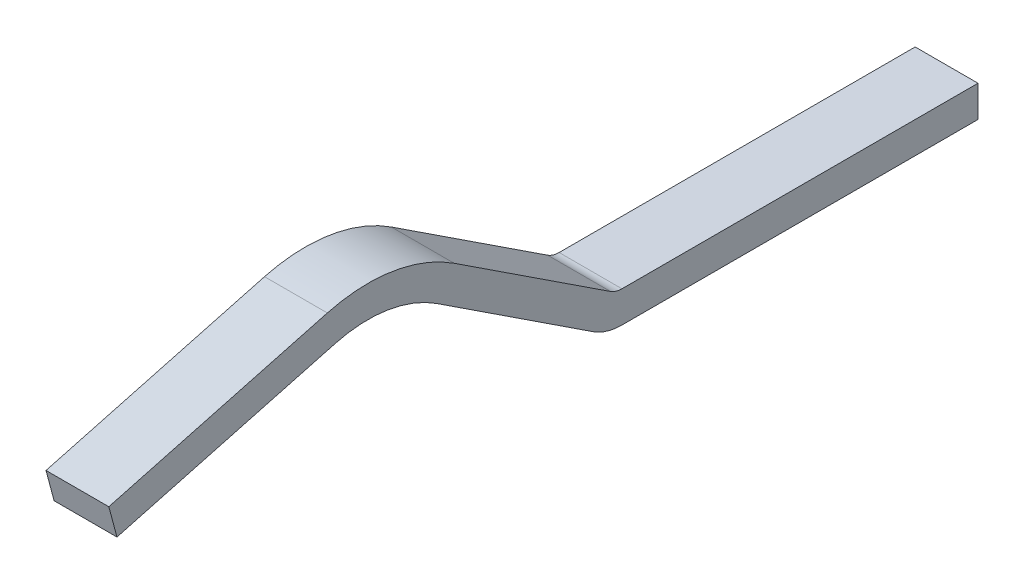
ISO-10303-21;
HEADER;
FILE_DESCRIPTION(('STEP AP214'),'2;1');
FILE_NAME('part.step','',(''),(''),'','','');
FILE_SCHEMA(('AUTOMOTIVE_DESIGN { 1 0 10303 214 1 1 1 1 }'));
ENDSEC;
DATA;
#1=APPLICATION_CONTEXT('core data for automotive mechanical design processes');
#2=APPLICATION_PROTOCOL_DEFINITION('international standard','automotive_design',2000,#1);
#3=PRODUCT_CONTEXT('',#1,'mechanical');
#4=PRODUCT('Part','Part','',(#3));
#5=PRODUCT_RELATED_PRODUCT_CATEGORY('part','',(#4));
#6=PRODUCT_DEFINITION_FORMATION('','',#4);
#7=PRODUCT_DEFINITION_CONTEXT('part definition',#1,'design');
#8=PRODUCT_DEFINITION('design','',#6,#7);
#9=PRODUCT_DEFINITION_SHAPE('','',#8);
#10=(LENGTH_UNIT() NAMED_UNIT(*) SI_UNIT(.MILLI.,.METRE.));
#11=(NAMED_UNIT(*) PLANE_ANGLE_UNIT() SI_UNIT($,.RADIAN.));
#12=(NAMED_UNIT(*) SI_UNIT($,.STERADIAN.) SOLID_ANGLE_UNIT());
#13=UNCERTAINTY_MEASURE_WITH_UNIT(LENGTH_MEASURE(1.E-05),#10,'distance_accuracy_value','');
#14=(GEOMETRIC_REPRESENTATION_CONTEXT(3) GLOBAL_UNCERTAINTY_ASSIGNED_CONTEXT((#13)) GLOBAL_UNIT_ASSIGNED_CONTEXT((#10,
#11,#12)) REPRESENTATION_CONTEXT('',''));
#15=CARTESIAN_POINT('',(0.,0.,0.));
#16=DIRECTION('',(0.,0.,1.));
#17=DIRECTION('',(1.,0.,0.));
#18=AXIS2_PLACEMENT_3D('',#15,#16,#17);
#19=CARTESIAN_POINT('',(0.149999999999985,5.07100850144757,-0.58999999999999));
#20=DIRECTION('',(-1.,0.,0.));
#21=DIRECTION('',(0.,0.,1.));
#22=AXIS2_PLACEMENT_3D('',#19,#20,#21);
#23=PLANE('',#22);
#24=DIRECTION('',(0.,0.,-1.));
#25=VECTOR('',#24,1.);
#26=CARTESIAN_POINT('',(0.149999999999985,4.97100850144757,-0.58999999999999));
#27=LINE('',#26,#25);
#28=CARTESIAN_POINT('',(0.149999999999985,4.97100850144757,-0.58999999999999));
#29=VERTEX_POINT('',#28);
#30=CARTESIAN_POINT('',(0.149999999999985,4.97100850144757,-2.28999999999999));
#31=VERTEX_POINT('',#30);
#32=EDGE_CURVE('E11',#29,#31,#27,.T.);
#33=ORIENTED_EDGE('',*,*,#32,.F.);
#34=CARTESIAN_POINT('',(0.149999999999985,5.07100850144757,-0.58999999999999));
#35=DIRECTION('',(-1.,0.,0.));
#36=DIRECTION('',(0.,0.,-1.));
#37=AXIS2_PLACEMENT_3D('',#34,#35,#36);
#38=CIRCLE('',#37,0.0999999999999998);
#39=CARTESIAN_POINT('',(0.149999999999985,4.98740012933444,-0.535139813046313));
#40=VERTEX_POINT('',#39);
#41=EDGE_CURVE('E24',#29,#40,#38,.T.);
#42=ORIENTED_EDGE('',*,*,#41,.T.);
#43=DIRECTION('',(0.,-0.548601869536769,-0.8360837211313));
#44=VECTOR('',#43,1.);
#45=CARTESIAN_POINT('',(0.149999999999985,5.47706279084843,0.211119000259158));
#46=LINE('',#45,#44);
#47=CARTESIAN_POINT('',(0.149999999999985,5.47706279084843,0.211119000259158));
#48=VERTEX_POINT('',#47);
#49=EDGE_CURVE('E205',#48,#40,#46,.T.);
#50=ORIENTED_EDGE('',*,*,#49,.F.);
#51=CARTESIAN_POINT('',(0.149999999999985,4.84999999999995,0.622570402411735));
#52=DIRECTION('',(-1.,0.,0.));
#53=DIRECTION('',(0.,0.,-1.));
#54=AXIS2_PLACEMENT_3D('',#51,#52,#53);
#55=CIRCLE('',#54,0.75);
#56=CARTESIAN_POINT('',(0.149999999999985,5.57444436971675,0.816684686238627));
#57=VERTEX_POINT('',#56);
#58=EDGE_CURVE('E202',#57,#48,#55,.T.);
#59=ORIENTED_EDGE('',*,*,#58,.F.);
#60=DIRECTION('',(0.,0.258819045102521,-0.965925826289068));
#61=VECTOR('',#60,1.);
#62=CARTESIAN_POINT('',(0.149999999999985,5.29488887394337,1.86000000000001));
#63=LINE('',#62,#61);
#64=CARTESIAN_POINT('',(0.149999999999985,5.29488887394337,1.86000000000001));
#65=VERTEX_POINT('',#64);
#66=EDGE_CURVE('E199',#65,#57,#63,.T.);
#67=ORIENTED_EDGE('',*,*,#66,.F.);
#68=DIRECTION('',(0.,0.965925826289068,0.258819045102522));
#69=VECTOR('',#68,1.);
#70=CARTESIAN_POINT('',(0.149999999999985,5.15000000000001,1.82117714323463));
#71=LINE('',#70,#69);
#72=CARTESIAN_POINT('',(0.149999999999985,5.15000000000001,1.82117714323463));
#73=VERTEX_POINT('',#72);
#74=EDGE_CURVE('E196',#73,#65,#71,.T.);
#75=ORIENTED_EDGE('',*,*,#74,.F.);
#76=DIRECTION('',(0.,-0.258819045102521,0.965925826289068));
#77=VECTOR('',#76,1.);
#78=CARTESIAN_POINT('',(0.149999999999985,5.42955549577339,0.777861829473248));
#79=LINE('',#78,#77);
#80=CARTESIAN_POINT('',(0.149999999999985,5.42955549577339,0.777861829473248));
#81=VERTEX_POINT('',#80);
#82=EDGE_CURVE('E193',#81,#73,#79,.T.);
#83=ORIENTED_EDGE('',*,*,#82,.F.);
#84=CARTESIAN_POINT('',(0.149999999999985,4.84999999999995,0.622570402411735));
#85=DIRECTION('',(1.,0.,0.));
#86=DIRECTION('',(0.,0.,-1.));
#87=AXIS2_PLACEMENT_3D('',#84,#85,#86);
#88=CIRCLE('',#87,0.6);
#89=CARTESIAN_POINT('',(0.149999999999985,5.35165023267873,0.293409280689673));
#90=VERTEX_POINT('',#89);
#91=EDGE_CURVE('E190',#90,#81,#88,.T.);
#92=ORIENTED_EDGE('',*,*,#91,.F.);
#93=DIRECTION('',(0.,0.548601869536769,0.8360837211313));
#94=VECTOR('',#93,1.);
#95=CARTESIAN_POINT('',(0.149999999999985,4.86198757116474,-0.452849532615799));
#96=LINE('',#95,#94);
#97=CARTESIAN_POINT('',(0.149999999999985,4.86198757116474,-0.452849532615799));
#98=VERTEX_POINT('',#97);
#99=EDGE_CURVE('E187',#98,#90,#96,.T.);
#100=ORIENTED_EDGE('',*,*,#99,.F.);
#101=CARTESIAN_POINT('',(0.149999999999985,5.07100850144757,-0.58999999999999));
#102=DIRECTION('',(-1.,0.,0.));
#103=DIRECTION('',(0.,0.,-1.));
#104=AXIS2_PLACEMENT_3D('',#101,#102,#103);
#105=CIRCLE('',#104,0.25);
#106=CARTESIAN_POINT('',(0.149999999999985,4.82100850144757,-0.58999999999999));
#107=VERTEX_POINT('',#106);
#108=EDGE_CURVE('E185',#107,#98,#105,.T.);
#109=ORIENTED_EDGE('',*,*,#108,.F.);
#110=DIRECTION('',(0.,0.,1.));
#111=VECTOR('',#110,1.);
#112=CARTESIAN_POINT('',(0.149999999999985,4.82100850144757,-0.58999999999999));
#113=LINE('',#112,#111);
#114=CARTESIAN_POINT('',(0.149999999999985,4.82100850144757,-2.28999999999999));
#115=VERTEX_POINT('',#114);
#116=EDGE_CURVE('E120',#115,#107,#113,.T.);
#117=ORIENTED_EDGE('',*,*,#116,.F.);
#118=DIRECTION('',(0.,-1.,0.));
#119=VECTOR('',#118,1.);
#120=CARTESIAN_POINT('',(0.149999999999985,5.07100850144757,-2.28999999999999));
#121=LINE('',#120,#119);
#122=EDGE_CURVE('E181',#31,#115,#121,.T.);
#123=ORIENTED_EDGE('',*,*,#122,.F.);
#124=EDGE_LOOP('',(#33,#42,#50,#59,#67,#75,#83,#92,#100,#109,#117,#123));
#125=FACE_BOUND('',#124,.T.);
#126=ADVANCED_FACE('F17',(#125),#23,.F.);
#127=CARTESIAN_POINT('',(-0.150000000000015,4.97100850144757,-2.28999999999999));
#128=DIRECTION('',(0.,0.,1.));
#129=DIRECTION('',(1.,0.,0.));
#130=AXIS2_PLACEMENT_3D('',#127,#128,#129);
#131=PLANE('',#130);
#132=DIRECTION('',(1.,0.,0.));
#133=VECTOR('',#132,1.);
#134=CARTESIAN_POINT('',(-0.150000000000015,4.82100850144757,-2.28999999999999));
#135=LINE('',#134,#133);
#136=CARTESIAN_POINT('',(-0.150000000000015,4.82100850144757,-2.28999999999999));
#137=VERTEX_POINT('',#136);
#138=EDGE_CURVE('E179',#137,#115,#135,.T.);
#139=ORIENTED_EDGE('',*,*,#138,.F.);
#140=DIRECTION('',(0.,-1.,0.));
#141=VECTOR('',#140,1.);
#142=CARTESIAN_POINT('',(-0.150000000000015,4.97100850144757,-2.28999999999999));
#143=LINE('',#142,#141);
#144=CARTESIAN_POINT('',(-0.150000000000015,4.97100850144757,-2.28999999999999));
#145=VERTEX_POINT('',#144);
#146=EDGE_CURVE('E126',#145,#137,#143,.T.);
#147=ORIENTED_EDGE('',*,*,#146,.F.);
#148=DIRECTION('',(-1.,0.,0.));
#149=VECTOR('',#148,1.);
#150=CARTESIAN_POINT('',(-0.150000000000015,4.97100850144757,-2.28999999999999));
#151=LINE('',#150,#149);
#152=EDGE_CURVE('E176',#31,#145,#151,.T.);
#153=ORIENTED_EDGE('',*,*,#152,.F.);
#154=ORIENTED_EDGE('',*,*,#122,.T.);
#155=EDGE_LOOP('',(#139,#147,#153,#154));
#156=FACE_BOUND('',#155,.T.);
#157=ADVANCED_FACE('F242',(#156),#131,.F.);
#158=CARTESIAN_POINT('',(-0.150000000000015,4.97100850144757,-0.58999999999999));
#159=DIRECTION('',(0.,-1.,0.));
#160=DIRECTION('',(0.,0.,-1.));
#161=AXIS2_PLACEMENT_3D('',#158,#159,#160);
#162=PLANE('',#161);
#163=ORIENTED_EDGE('',*,*,#152,.T.);
#164=DIRECTION('',(0.,0.,-1.));
#165=VECTOR('',#164,1.);
#166=CARTESIAN_POINT('',(-0.150000000000015,4.97100850144757,-0.58999999999999));
#167=LINE('',#166,#165);
#168=CARTESIAN_POINT('',(-0.150000000000015,4.97100850144757,-0.58999999999999));
#169=VERTEX_POINT('',#168);
#170=EDGE_CURVE('E174',#169,#145,#167,.T.);
#171=ORIENTED_EDGE('',*,*,#170,.F.);
#172=DIRECTION('',(-1.,0.,0.));
#173=VECTOR('',#172,1.);
#174=CARTESIAN_POINT('',(-0.150000000000015,4.97100850144757,-0.58999999999999));
#175=LINE('',#174,#173);
#176=EDGE_CURVE('E171',#29,#169,#175,.T.);
#177=ORIENTED_EDGE('',*,*,#176,.F.);
#178=ORIENTED_EDGE('',*,*,#32,.T.);
#179=EDGE_LOOP('',(#163,#171,#177,#178));
#180=FACE_BOUND('',#179,.T.);
#181=ADVANCED_FACE('F246',(#180),#162,.F.);
#182=CARTESIAN_POINT('',(-0.150000000000015,5.47706279084843,0.211119000259158));
#183=DIRECTION('',(0.,-0.8360837211313,0.548601869536769));
#184=DIRECTION('',(0.,-0.548601869536769,-0.8360837211313));
#185=AXIS2_PLACEMENT_3D('',#182,#183,#184);
#186=PLANE('',#185);
#187=DIRECTION('',(1.,0.,0.));
#188=VECTOR('',#187,1.);
#189=CARTESIAN_POINT('',(-0.150000000000015,4.98740012933444,-0.535139813046313));
#190=LINE('',#189,#188);
#191=CARTESIAN_POINT('',(-0.150000000000015,4.98740012933444,-0.535139813046313));
#192=VERTEX_POINT('',#191);
#193=EDGE_CURVE('E168',#192,#40,#190,.T.);
#194=ORIENTED_EDGE('',*,*,#193,.F.);
#195=DIRECTION('',(0.,-0.548601869536769,-0.8360837211313));
#196=VECTOR('',#195,1.);
#197=CARTESIAN_POINT('',(-0.150000000000015,5.47706279084843,0.211119000259158));
#198=LINE('',#197,#196);
#199=CARTESIAN_POINT('',(-0.150000000000015,5.47706279084843,0.211119000259158));
#200=VERTEX_POINT('',#199);
#201=EDGE_CURVE('E166',#200,#192,#198,.T.);
#202=ORIENTED_EDGE('',*,*,#201,.F.);
#203=DIRECTION('',(-1.,0.,0.));
#204=VECTOR('',#203,1.);
#205=CARTESIAN_POINT('',(-0.150000000000015,5.47706279084843,0.211119000259158));
#206=LINE('',#205,#204);
#207=EDGE_CURVE('E163',#48,#200,#206,.T.);
#208=ORIENTED_EDGE('',*,*,#207,.F.);
#209=ORIENTED_EDGE('',*,*,#49,.T.);
#210=EDGE_LOOP('',(#194,#202,#208,#209));
#211=FACE_BOUND('',#210,.T.);
#212=ADVANCED_FACE('F210',(#211),#186,.F.);
#213=CARTESIAN_POINT('',(-0.150000000000015,4.84999999999995,0.622570402411735));
#214=DIRECTION('',(1.,0.,0.));
#215=DIRECTION('',(0.,0.,-1.));
#216=AXIS2_PLACEMENT_3D('',#213,#214,#215);
#217=CYLINDRICAL_SURFACE('',#216,0.75);
#218=CARTESIAN_POINT('',(-0.150000000000015,4.84999999999995,0.622570402411735));
#219=DIRECTION('',(1.,0.,0.));
#220=DIRECTION('',(0.,0.,-1.));
#221=AXIS2_PLACEMENT_3D('',#218,#219,#220);
#222=CIRCLE('',#221,0.75);
#223=CARTESIAN_POINT('',(-0.150000000000015,5.57444436971675,0.816684686238627));
#224=VERTEX_POINT('',#223);
#225=EDGE_CURVE('E161',#200,#224,#222,.T.);
#226=ORIENTED_EDGE('',*,*,#225,.T.);
#227=DIRECTION('',(1.,0.,0.));
#228=VECTOR('',#227,1.);
#229=CARTESIAN_POINT('',(-0.150000000000015,5.57444436971675,0.816684686238627));
#230=LINE('',#229,#228);
#231=EDGE_CURVE('E158',#224,#57,#230,.T.);
#232=ORIENTED_EDGE('',*,*,#231,.T.);
#233=ORIENTED_EDGE('',*,*,#58,.T.);
#234=ORIENTED_EDGE('',*,*,#207,.T.);
#235=EDGE_LOOP('',(#226,#232,#233,#234));
#236=FACE_BOUND('',#235,.T.);
#237=ADVANCED_FACE('F215',(#236),#217,.T.);
#238=CARTESIAN_POINT('',(-0.150000000000015,5.29488887394337,1.86000000000001));
#239=DIRECTION('',(0.,-0.965925826289068,-0.258819045102522));
#240=DIRECTION('',(0.,0.258819045102522,-0.965925826289068));
#241=AXIS2_PLACEMENT_3D('',#238,#239,#240);
#242=PLANE('',#241);
#243=ORIENTED_EDGE('',*,*,#231,.F.);
#244=DIRECTION('',(0.,0.258819045102522,-0.965925826289068));
#245=VECTOR('',#244,1.);
#246=CARTESIAN_POINT('',(-0.150000000000015,5.29488887394337,1.86000000000001));
#247=LINE('',#246,#245);
#248=CARTESIAN_POINT('',(-0.150000000000015,5.29488887394337,1.86000000000001));
#249=VERTEX_POINT('',#248);
#250=EDGE_CURVE('E155',#249,#224,#247,.T.);
#251=ORIENTED_EDGE('',*,*,#250,.F.);
#252=DIRECTION('',(-1.,0.,0.));
#253=VECTOR('',#252,1.);
#254=CARTESIAN_POINT('',(-0.150000000000015,5.29488887394337,1.86000000000001));
#255=LINE('',#254,#253);
#256=EDGE_CURVE('E152',#65,#249,#255,.T.);
#257=ORIENTED_EDGE('',*,*,#256,.F.);
#258=ORIENTED_EDGE('',*,*,#66,.T.);
#259=EDGE_LOOP('',(#243,#251,#257,#258));
#260=FACE_BOUND('',#259,.T.);
#261=ADVANCED_FACE('F219',(#260),#242,.F.);
#262=CARTESIAN_POINT('',(-0.150000000000015,5.15000000000001,1.82117714323463));
#263=DIRECTION('',(0.,0.258819045102522,-0.965925826289068));
#264=DIRECTION('',(0.,0.965925826289068,0.258819045102522));
#265=AXIS2_PLACEMENT_3D('',#262,#263,#264);
#266=PLANE('',#265);
#267=ORIENTED_EDGE('',*,*,#256,.T.);
#268=DIRECTION('',(0.,0.965925826289068,0.258819045102522));
#269=VECTOR('',#268,1.);
#270=CARTESIAN_POINT('',(-0.150000000000015,5.15000000000001,1.82117714323463));
#271=LINE('',#270,#269);
#272=CARTESIAN_POINT('',(-0.150000000000015,5.15000000000001,1.82117714323463));
#273=VERTEX_POINT('',#272);
#274=EDGE_CURVE('E149',#273,#249,#271,.T.);
#275=ORIENTED_EDGE('',*,*,#274,.F.);
#276=DIRECTION('',(-1.,0.,0.));
#277=VECTOR('',#276,1.);
#278=CARTESIAN_POINT('',(-0.150000000000015,5.15000000000001,1.82117714323463));
#279=LINE('',#278,#277);
#280=EDGE_CURVE('E146',#73,#273,#279,.T.);
#281=ORIENTED_EDGE('',*,*,#280,.F.);
#282=ORIENTED_EDGE('',*,*,#74,.T.);
#283=EDGE_LOOP('',(#267,#275,#281,#282));
#284=FACE_BOUND('',#283,.T.);
#285=ADVANCED_FACE('F221',(#284),#266,.F.);
#286=CARTESIAN_POINT('',(-0.150000000000015,5.42955549577339,0.777861829473248));
#287=DIRECTION('',(0.,0.965925826289068,0.258819045102521));
#288=DIRECTION('',(0.,-0.258819045102521,0.965925826289068));
#289=AXIS2_PLACEMENT_3D('',#286,#287,#288);
#290=PLANE('',#289);
#291=ORIENTED_EDGE('',*,*,#280,.T.);
#292=DIRECTION('',(0.,-0.258819045102521,0.965925826289068));
#293=VECTOR('',#292,1.);
#294=CARTESIAN_POINT('',(-0.150000000000015,5.42955549577339,0.777861829473248));
#295=LINE('',#294,#293);
#296=CARTESIAN_POINT('',(-0.150000000000015,5.42955549577339,0.777861829473248));
#297=VERTEX_POINT('',#296);
#298=EDGE_CURVE('E143',#297,#273,#295,.T.);
#299=ORIENTED_EDGE('',*,*,#298,.F.);
#300=DIRECTION('',(-1.,0.,0.));
#301=VECTOR('',#300,1.);
#302=CARTESIAN_POINT('',(-0.150000000000015,5.42955549577339,0.777861829473248));
#303=LINE('',#302,#301);
#304=EDGE_CURVE('E140',#81,#297,#303,.T.);
#305=ORIENTED_EDGE('',*,*,#304,.F.);
#306=ORIENTED_EDGE('',*,*,#82,.T.);
#307=EDGE_LOOP('',(#291,#299,#305,#306));
#308=FACE_BOUND('',#307,.T.);
#309=ADVANCED_FACE('F226',(#308),#290,.F.);
#310=CARTESIAN_POINT('',(-0.150000000000015,4.84999999999995,0.622570402411735));
#311=DIRECTION('',(1.,0.,0.));
#312=DIRECTION('',(0.,0.,-1.));
#313=AXIS2_PLACEMENT_3D('',#310,#311,#312);
#314=CYLINDRICAL_SURFACE('',#313,0.6);
#315=ORIENTED_EDGE('',*,*,#304,.T.);
#316=CARTESIAN_POINT('',(-0.150000000000015,4.84999999999995,0.622570402411735));
#317=DIRECTION('',(1.,0.,0.));
#318=DIRECTION('',(0.,0.,-1.));
#319=AXIS2_PLACEMENT_3D('',#316,#317,#318);
#320=CIRCLE('',#319,0.6);
#321=CARTESIAN_POINT('',(-0.150000000000015,5.35165023267873,0.293409280689673));
#322=VERTEX_POINT('',#321);
#323=EDGE_CURVE('E137',#322,#297,#320,.T.);
#324=ORIENTED_EDGE('',*,*,#323,.F.);
#325=DIRECTION('',(-1.,0.,0.));
#326=VECTOR('',#325,1.);
#327=CARTESIAN_POINT('',(-0.150000000000015,5.35165023267873,0.293409280689674));
#328=LINE('',#327,#326);
#329=EDGE_CURVE('E135',#90,#322,#328,.T.);
#330=ORIENTED_EDGE('',*,*,#329,.F.);
#331=ORIENTED_EDGE('',*,*,#91,.T.);
#332=EDGE_LOOP('',(#315,#324,#330,#331));
#333=FACE_BOUND('',#332,.T.);
#334=ADVANCED_FACE('F228',(#333),#314,.F.);
#335=CARTESIAN_POINT('',(-0.150000000000015,4.86198757116474,-0.452849532615799));
#336=DIRECTION('',(0.,0.8360837211313,-0.548601869536769));
#337=DIRECTION('',(0.,0.548601869536769,0.8360837211313));
#338=AXIS2_PLACEMENT_3D('',#335,#336,#337);
#339=PLANE('',#338);
#340=ORIENTED_EDGE('',*,*,#329,.T.);
#341=DIRECTION('',(0.,0.548601869536769,0.8360837211313));
#342=VECTOR('',#341,1.);
#343=CARTESIAN_POINT('',(-0.150000000000015,4.86198757116474,-0.452849532615799));
#344=LINE('',#343,#342);
#345=CARTESIAN_POINT('',(-0.150000000000015,4.86198757116474,-0.452849532615799));
#346=VERTEX_POINT('',#345);
#347=EDGE_CURVE('E133',#346,#322,#344,.T.);
#348=ORIENTED_EDGE('',*,*,#347,.F.);
#349=DIRECTION('',(-1.,0.,0.));
#350=VECTOR('',#349,1.);
#351=CARTESIAN_POINT('',(-0.150000000000015,4.86198757116474,-0.452849532615799));
#352=LINE('',#351,#350);
#353=EDGE_CURVE('E109',#98,#346,#352,.T.);
#354=ORIENTED_EDGE('',*,*,#353,.F.);
#355=ORIENTED_EDGE('',*,*,#99,.T.);
#356=EDGE_LOOP('',(#340,#348,#354,#355));
#357=FACE_BOUND('',#356,.T.);
#358=ADVANCED_FACE('F231',(#357),#339,.F.);
#359=CARTESIAN_POINT('',(-0.150000000000015,5.07100850144757,-0.58999999999999));
#360=DIRECTION('',(1.,0.,0.));
#361=DIRECTION('',(0.,0.,-1.));
#362=AXIS2_PLACEMENT_3D('',#359,#360,#361);
#363=CYLINDRICAL_SURFACE('',#362,0.25);
#364=CARTESIAN_POINT('',(-0.150000000000015,5.07100850144757,-0.58999999999999));
#365=DIRECTION('',(1.,0.,0.));
#366=DIRECTION('',(0.,0.,-1.));
#367=AXIS2_PLACEMENT_3D('',#364,#365,#366);
#368=CIRCLE('',#367,0.25);
#369=CARTESIAN_POINT('',(-0.150000000000015,4.82100850144757,-0.58999999999999));
#370=VERTEX_POINT('',#369);
#371=EDGE_CURVE('E103',#346,#370,#368,.T.);
#372=ORIENTED_EDGE('',*,*,#371,.T.);
#373=DIRECTION('',(1.,0.,0.));
#374=VECTOR('',#373,1.);
#375=CARTESIAN_POINT('',(-0.150000000000015,4.82100850144757,-0.58999999999999));
#376=LINE('',#375,#374);
#377=EDGE_CURVE('E107',#370,#107,#376,.T.);
#378=ORIENTED_EDGE('',*,*,#377,.T.);
#379=ORIENTED_EDGE('',*,*,#108,.T.);
#380=ORIENTED_EDGE('',*,*,#353,.T.);
#381=EDGE_LOOP('',(#372,#378,#379,#380));
#382=FACE_BOUND('',#381,.T.);
#383=ADVANCED_FACE('F105',(#382),#363,.T.);
#384=CARTESIAN_POINT('',(-0.150000000000015,4.82100850144757,-1.98999999999999));
#385=DIRECTION('',(0.,1.,0.));
#386=DIRECTION('',(0.,0.,1.));
#387=AXIS2_PLACEMENT_3D('',#384,#385,#386);
#388=PLANE('',#387);
#389=ORIENTED_EDGE('',*,*,#377,.F.);
#390=DIRECTION('',(0.,0.,1.));
#391=VECTOR('',#390,1.);
#392=CARTESIAN_POINT('',(-0.150000000000015,4.82100850144757,-1.98999999999999));
#393=LINE('',#392,#391);
#394=EDGE_CURVE('E119',#137,#370,#393,.T.);
#395=ORIENTED_EDGE('',*,*,#394,.F.);
#396=ORIENTED_EDGE('',*,*,#138,.T.);
#397=ORIENTED_EDGE('',*,*,#116,.T.);
#398=EDGE_LOOP('',(#389,#395,#396,#397));
#399=FACE_BOUND('',#398,.T.);
#400=ADVANCED_FACE('F117',(#399),#388,.F.);
#401=CARTESIAN_POINT('',(-0.150000000000015,5.07100850144757,-0.58999999999999));
#402=DIRECTION('',(-1.,0.,0.));
#403=DIRECTION('',(0.,0.,1.));
#404=AXIS2_PLACEMENT_3D('',#401,#402,#403);
#405=PLANE('',#404);
#406=ORIENTED_EDGE('',*,*,#201,.T.);
#407=CARTESIAN_POINT('',(-0.150000000000015,5.07100850144757,-0.58999999999999));
#408=DIRECTION('',(1.,0.,0.));
#409=DIRECTION('',(0.,0.,-1.));
#410=AXIS2_PLACEMENT_3D('',#407,#408,#409);
#411=CIRCLE('',#410,0.0999999999999998);
#412=EDGE_CURVE('E127',#192,#169,#411,.T.);
#413=ORIENTED_EDGE('',*,*,#412,.T.);
#414=ORIENTED_EDGE('',*,*,#170,.T.);
#415=ORIENTED_EDGE('',*,*,#146,.T.);
#416=ORIENTED_EDGE('',*,*,#394,.T.);
#417=ORIENTED_EDGE('',*,*,#371,.F.);
#418=ORIENTED_EDGE('',*,*,#347,.T.);
#419=ORIENTED_EDGE('',*,*,#323,.T.);
#420=ORIENTED_EDGE('',*,*,#298,.T.);
#421=ORIENTED_EDGE('',*,*,#274,.T.);
#422=ORIENTED_EDGE('',*,*,#250,.T.);
#423=ORIENTED_EDGE('',*,*,#225,.F.);
#424=EDGE_LOOP('',(#406,#413,#414,#415,#416,#417,#418,#419,#420,#421,#422,#423));
#425=FACE_BOUND('',#424,.T.);
#426=ADVANCED_FACE('F124',(#425),#405,.T.);
#427=CARTESIAN_POINT('',(-0.150000000000015,5.07100850144757,-0.58999999999999));
#428=DIRECTION('',(1.,0.,0.));
#429=DIRECTION('',(0.,0.,-1.));
#430=AXIS2_PLACEMENT_3D('',#427,#428,#429);
#431=CYLINDRICAL_SURFACE('',#430,0.0999999999999998);
#432=ORIENTED_EDGE('',*,*,#176,.T.);
#433=ORIENTED_EDGE('',*,*,#412,.F.);
#434=ORIENTED_EDGE('',*,*,#193,.T.);
#435=ORIENTED_EDGE('',*,*,#41,.F.);
#436=EDGE_LOOP('',(#432,#433,#434,#435));
#437=FACE_BOUND('',#436,.T.);
#438=ADVANCED_FACE('F212',(#437),#431,.F.);
#439=CLOSED_SHELL('',(#126,#157,#181,#212,#237,#261,#285,#309,#334,#358,#383,#400,#426,#438));
#440=MANIFOLD_SOLID_BREP('B1',#439);
#441=ADVANCED_BREP_SHAPE_REPRESENTATION('',(#18,#440),#14);
#442=SHAPE_DEFINITION_REPRESENTATION(#9,#441);
ENDSEC;
END-ISO-10303-21;
